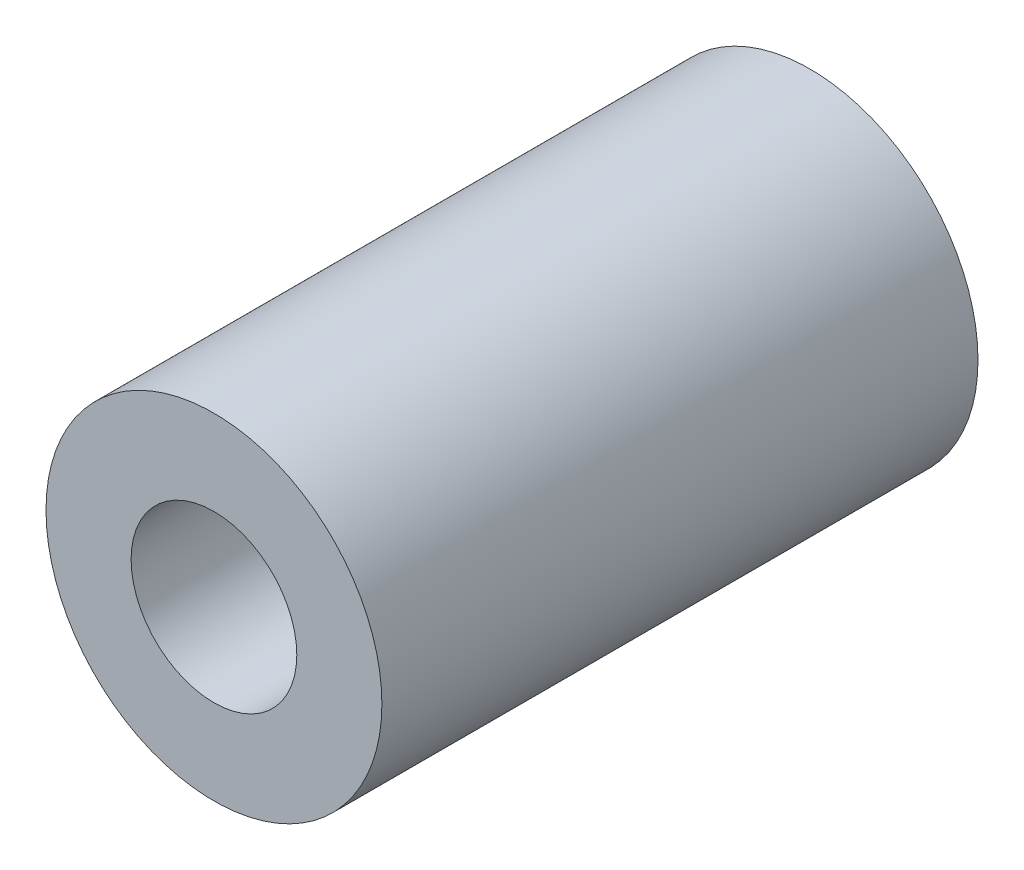
ISO-10303-21;
HEADER;
FILE_DESCRIPTION(('STEP AP214'),'2;1');
FILE_NAME('part.step','',(''),(''),'','','');
FILE_SCHEMA(('AUTOMOTIVE_DESIGN { 1 0 10303 214 1 1 1 1 }'));
ENDSEC;
DATA;
#1=APPLICATION_CONTEXT('core data for automotive mechanical design processes');
#2=APPLICATION_PROTOCOL_DEFINITION('international standard','automotive_design',2000,#1);
#3=PRODUCT_CONTEXT('',#1,'mechanical');
#4=PRODUCT('Part','Part','',(#3));
#5=PRODUCT_RELATED_PRODUCT_CATEGORY('part','',(#4));
#6=PRODUCT_DEFINITION_FORMATION('','',#4);
#7=PRODUCT_DEFINITION_CONTEXT('part definition',#1,'design');
#8=PRODUCT_DEFINITION('design','',#6,#7);
#9=PRODUCT_DEFINITION_SHAPE('','',#8);
#10=(LENGTH_UNIT() NAMED_UNIT(*) SI_UNIT(.MILLI.,.METRE.));
#11=(NAMED_UNIT(*) PLANE_ANGLE_UNIT() SI_UNIT($,.RADIAN.));
#12=(NAMED_UNIT(*) SI_UNIT($,.STERADIAN.) SOLID_ANGLE_UNIT());
#13=UNCERTAINTY_MEASURE_WITH_UNIT(LENGTH_MEASURE(1.E-05),#10,'distance_accuracy_value','');
#14=(GEOMETRIC_REPRESENTATION_CONTEXT(3) GLOBAL_UNCERTAINTY_ASSIGNED_CONTEXT((#13)) GLOBAL_UNIT_ASSIGNED_CONTEXT((#10,
#11,#12)) REPRESENTATION_CONTEXT('',''));
#15=CARTESIAN_POINT('',(0.,0.,0.));
#16=DIRECTION('',(0.,0.,1.));
#17=DIRECTION('',(1.,0.,0.));
#18=AXIS2_PLACEMENT_3D('',#15,#16,#17);
#19=CARTESIAN_POINT('',(0.,0.,26.62));
#20=DIRECTION('',(0.,0.,-1.));
#21=DIRECTION('',(-1.,0.,0.));
#22=AXIS2_PLACEMENT_3D('',#19,#20,#21);
#23=CYLINDRICAL_SURFACE('',#22,7.5);
#24=CARTESIAN_POINT('',(0.,0.,26.62));
#25=DIRECTION('',(0.,0.,1.));
#26=DIRECTION('',(1.,0.,0.));
#27=AXIS2_PLACEMENT_3D('',#24,#25,#26);
#28=CIRCLE('',#27,7.5);
#29=CARTESIAN_POINT('',(-7.5,0.,26.62));
#30=VERTEX_POINT('',#29);
#31=EDGE_CURVE('E10',#30,#30,#28,.T.);
#32=CARTESIAN_POINT('',(0.,0.,0.));
#33=DIRECTION('',(0.,0.,1.));
#34=DIRECTION('',(1.,0.,0.));
#35=AXIS2_PLACEMENT_3D('',#32,#33,#34);
#36=CIRCLE('',#35,7.5);
#37=CARTESIAN_POINT('',(-7.5,0.,0.));
#38=VERTEX_POINT('',#37);
#39=EDGE_CURVE('E35',#38,#38,#36,.T.);
#40=CARTESIAN_POINT('',(-7.5,0.,26.62));
#41=CARTESIAN_POINT('',(-7.5,0.,26.3427083333333));
#42=CARTESIAN_POINT('',(-7.5,0.,26.0654166666667));
#43=CARTESIAN_POINT('',(-7.5,0.,25.5108333333333));
#44=CARTESIAN_POINT('',(-7.5,0.,25.2335416666667));
#45=CARTESIAN_POINT('',(-7.5,0.,24.6789583333333));
#46=CARTESIAN_POINT('',(-7.5,0.,24.4016666666667));
#47=CARTESIAN_POINT('',(-7.5,0.,23.8470833333333));
#48=CARTESIAN_POINT('',(-7.5,0.,23.5697916666667));
#49=CARTESIAN_POINT('',(-7.5,0.,23.0152083333333));
#50=CARTESIAN_POINT('',(-7.5,0.,22.7379166666667));
#51=CARTESIAN_POINT('',(-7.5,0.,22.1833333333333));
#52=CARTESIAN_POINT('',(-7.5,0.,21.9060416666667));
#53=CARTESIAN_POINT('',(-7.5,0.,21.3514583333333));
#54=CARTESIAN_POINT('',(-7.5,0.,21.0741666666667));
#55=CARTESIAN_POINT('',(-7.5,0.,20.5195833333333));
#56=CARTESIAN_POINT('',(-7.5,0.,20.2422916666667));
#57=CARTESIAN_POINT('',(-7.5,0.,19.6877083333333));
#58=CARTESIAN_POINT('',(-7.5,0.,19.4104166666667));
#59=CARTESIAN_POINT('',(-7.5,0.,18.8558333333333));
#60=CARTESIAN_POINT('',(-7.5,0.,18.5785416666667));
#61=CARTESIAN_POINT('',(-7.5,0.,18.0239583333333));
#62=CARTESIAN_POINT('',(-7.5,0.,17.7466666666667));
#63=CARTESIAN_POINT('',(-7.5,0.,17.1920833333333));
#64=CARTESIAN_POINT('',(-7.5,0.,16.9147916666667));
#65=CARTESIAN_POINT('',(-7.5,0.,16.3602083333333));
#66=CARTESIAN_POINT('',(-7.5,0.,16.0829166666667));
#67=CARTESIAN_POINT('',(-7.5,0.,15.5283333333333));
#68=CARTESIAN_POINT('',(-7.5,0.,15.2510416666667));
#69=CARTESIAN_POINT('',(-7.5,0.,14.6964583333333));
#70=CARTESIAN_POINT('',(-7.5,0.,14.4191666666667));
#71=CARTESIAN_POINT('',(-7.5,0.,13.8645833333333));
#72=CARTESIAN_POINT('',(-7.5,0.,13.5872916666667));
#73=CARTESIAN_POINT('',(-7.5,0.,13.0327083333333));
#74=CARTESIAN_POINT('',(-7.5,0.,12.7554166666667));
#75=CARTESIAN_POINT('',(-7.5,0.,12.2008333333333));
#76=CARTESIAN_POINT('',(-7.5,0.,11.9235416666667));
#77=CARTESIAN_POINT('',(-7.5,0.,11.3689583333333));
#78=CARTESIAN_POINT('',(-7.5,0.,11.0916666666667));
#79=CARTESIAN_POINT('',(-7.5,0.,10.5370833333333));
#80=CARTESIAN_POINT('',(-7.5,0.,10.2597916666667));
#81=CARTESIAN_POINT('',(-7.5,0.,9.70520833333333));
#82=CARTESIAN_POINT('',(-7.5,0.,9.42791666666667));
#83=CARTESIAN_POINT('',(-7.5,0.,8.87333333333333));
#84=CARTESIAN_POINT('',(-7.5,0.,8.59604166666667));
#85=CARTESIAN_POINT('',(-7.5,0.,8.04145833333333));
#86=CARTESIAN_POINT('',(-7.5,0.,7.76416666666667));
#87=CARTESIAN_POINT('',(-7.5,0.,7.20958333333333));
#88=CARTESIAN_POINT('',(-7.5,0.,6.93229166666667));
#89=CARTESIAN_POINT('',(-7.5,0.,6.37770833333334));
#90=CARTESIAN_POINT('',(-7.5,0.,6.10041666666667));
#91=CARTESIAN_POINT('',(-7.5,0.,5.54583333333333));
#92=CARTESIAN_POINT('',(-7.5,0.,5.26854166666667));
#93=CARTESIAN_POINT('',(-7.5,0.,4.71395833333333));
#94=CARTESIAN_POINT('',(-7.5,0.,4.43666666666667));
#95=CARTESIAN_POINT('',(-7.5,0.,3.88208333333333));
#96=CARTESIAN_POINT('',(-7.5,0.,3.60479166666667));
#97=CARTESIAN_POINT('',(-7.5,0.,3.05020833333333));
#98=CARTESIAN_POINT('',(-7.5,0.,2.77291666666667));
#99=CARTESIAN_POINT('',(-7.5,0.,2.21833333333333));
#100=CARTESIAN_POINT('',(-7.5,0.,1.94104166666667));
#101=CARTESIAN_POINT('',(-7.5,0.,1.38645833333333));
#102=CARTESIAN_POINT('',(-7.5,0.,1.10916666666667));
#103=CARTESIAN_POINT('',(-7.5,0.,0.554583333333333));
#104=CARTESIAN_POINT('',(-7.5,0.,0.277291666666667));
#105=CARTESIAN_POINT('',(-7.5,0.,0.));
#106=B_SPLINE_CURVE_WITH_KNOTS('',3,(#40,#41,#42,#43,#44,#45,#46,#47,#48,#49,#50,#51,#52,#53,
#54,#55,#56,#57,#58,#59,#60,#61,#62,#63,#64,#65,#66,#67,#68,#69,#70,#71,#72,#73,#74,#75,#76,#77,
#78,#79,#80,#81,#82,#83,#84,#85,#86,#87,#88,#89,#90,#91,#92,#93,#94,#95,#96,#97,#98,#99,#100,
#101,#102,#103,#104,#105),.UNSPECIFIED.,.F.,.F.,(4,2,2,2,2,2,2,2,2,2,2,2,2,2,2,2,2,2,2,2,2,2,2,
2,2,2,2,2,2,2,2,2,4),(0.,0.831874999999999,1.66375,2.495625,3.3275,4.159375,4.99125,5.823125,
6.655,7.486875,8.31875,9.150625,9.9825,10.814375,11.64625,12.478125,13.31,14.141875,14.97375,
15.805625,16.6375,17.469375,18.30125,19.133125,19.965,20.796875,21.62875,22.460625,23.2925,
24.124375,24.95625,25.788125,26.62),.UNSPECIFIED.);
#107=EDGE_CURVE('BSEAM32',#30,#38,#106,.T.);
#108=ORIENTED_EDGE('',*,*,#31,.F.);
#109=ORIENTED_EDGE('',*,*,#39,.T.);
#110=ORIENTED_EDGE('',*,*,#107,.T.);
#111=ORIENTED_EDGE('',*,*,#107,.F.);
#112=EDGE_LOOP('',(#108,#110,#109,#111));
#113=FACE_BOUND('',#112,.T.);
#114=ADVANCED_FACE('F32',(#113),#23,.T.);
#115=CARTESIAN_POINT('',(0.,0.,26.62));
#116=DIRECTION('',(0.,0.,1.));
#117=DIRECTION('',(1.,0.,0.));
#118=AXIS2_PLACEMENT_3D('',#115,#116,#117);
#119=PLANE('',#118);
#120=CARTESIAN_POINT('',(0.,0.,26.62));
#121=DIRECTION('',(0.,0.,-1.));
#122=DIRECTION('',(-1.,0.,0.));
#123=AXIS2_PLACEMENT_3D('',#120,#121,#122);
#124=CIRCLE('',#123,3.7);
#125=CARTESIAN_POINT('',(-3.7,0.,26.62));
#126=VERTEX_POINT('',#125);
#127=EDGE_CURVE('E42',#126,#126,#124,.T.);
#128=ORIENTED_EDGE('',*,*,#127,.T.);
#129=EDGE_LOOP('',(#128));
#130=FACE_BOUND('',#129,.T.);
#131=ORIENTED_EDGE('',*,*,#31,.T.);
#132=EDGE_LOOP('',(#131));
#133=FACE_BOUND('',#132,.T.);
#134=ADVANCED_FACE('F50',(#130,#133),#119,.T.);
#135=CARTESIAN_POINT('',(0.,0.,0.));
#136=DIRECTION('',(0.,0.,1.));
#137=DIRECTION('',(1.,0.,0.));
#138=AXIS2_PLACEMENT_3D('',#135,#136,#137);
#139=PLANE('',#138);
#140=CARTESIAN_POINT('',(0.,0.,0.));
#141=DIRECTION('',(0.,0.,-1.));
#142=DIRECTION('',(-1.,0.,0.));
#143=AXIS2_PLACEMENT_3D('',#140,#141,#142);
#144=CIRCLE('',#143,3.7);
#145=CARTESIAN_POINT('',(-3.7,0.,0.));
#146=VERTEX_POINT('',#145);
#147=EDGE_CURVE('E44',#146,#146,#144,.T.);
#148=ORIENTED_EDGE('',*,*,#147,.F.);
#149=EDGE_LOOP('',(#148));
#150=FACE_BOUND('',#149,.T.);
#151=ORIENTED_EDGE('',*,*,#39,.F.);
#152=EDGE_LOOP('',(#151));
#153=FACE_BOUND('',#152,.T.);
#154=ADVANCED_FACE('F55',(#150,#153),#139,.F.);
#155=CARTESIAN_POINT('',(0.,0.,26.62));
#156=DIRECTION('',(0.,0.,-1.));
#157=DIRECTION('',(-1.,0.,0.));
#158=AXIS2_PLACEMENT_3D('',#155,#156,#157);
#159=CYLINDRICAL_SURFACE('',#158,3.7);
#160=CARTESIAN_POINT('',(-3.7,0.,26.62));
#161=CARTESIAN_POINT('',(-3.7,0.,26.3427083333333));
#162=CARTESIAN_POINT('',(-3.7,0.,26.0654166666667));
#163=CARTESIAN_POINT('',(-3.7,0.,25.5108333333333));
#164=CARTESIAN_POINT('',(-3.7,0.,25.2335416666667));
#165=CARTESIAN_POINT('',(-3.7,0.,24.6789583333333));
#166=CARTESIAN_POINT('',(-3.7,0.,24.4016666666667));
#167=CARTESIAN_POINT('',(-3.7,0.,23.8470833333333));
#168=CARTESIAN_POINT('',(-3.7,0.,23.5697916666667));
#169=CARTESIAN_POINT('',(-3.7,0.,23.0152083333333));
#170=CARTESIAN_POINT('',(-3.7,0.,22.7379166666667));
#171=CARTESIAN_POINT('',(-3.7,0.,22.1833333333333));
#172=CARTESIAN_POINT('',(-3.7,0.,21.9060416666667));
#173=CARTESIAN_POINT('',(-3.7,0.,21.3514583333333));
#174=CARTESIAN_POINT('',(-3.7,0.,21.0741666666667));
#175=CARTESIAN_POINT('',(-3.7,0.,20.5195833333333));
#176=CARTESIAN_POINT('',(-3.7,0.,20.2422916666667));
#177=CARTESIAN_POINT('',(-3.7,0.,19.6877083333333));
#178=CARTESIAN_POINT('',(-3.7,0.,19.4104166666667));
#179=CARTESIAN_POINT('',(-3.7,0.,18.8558333333333));
#180=CARTESIAN_POINT('',(-3.7,0.,18.5785416666667));
#181=CARTESIAN_POINT('',(-3.7,0.,18.0239583333333));
#182=CARTESIAN_POINT('',(-3.7,0.,17.7466666666667));
#183=CARTESIAN_POINT('',(-3.7,0.,17.1920833333333));
#184=CARTESIAN_POINT('',(-3.7,0.,16.9147916666667));
#185=CARTESIAN_POINT('',(-3.7,0.,16.3602083333333));
#186=CARTESIAN_POINT('',(-3.7,0.,16.0829166666667));
#187=CARTESIAN_POINT('',(-3.7,0.,15.5283333333333));
#188=CARTESIAN_POINT('',(-3.7,0.,15.2510416666667));
#189=CARTESIAN_POINT('',(-3.7,0.,14.6964583333333));
#190=CARTESIAN_POINT('',(-3.7,0.,14.4191666666667));
#191=CARTESIAN_POINT('',(-3.7,0.,13.8645833333333));
#192=CARTESIAN_POINT('',(-3.7,0.,13.5872916666667));
#193=CARTESIAN_POINT('',(-3.7,0.,13.0327083333333));
#194=CARTESIAN_POINT('',(-3.7,0.,12.7554166666667));
#195=CARTESIAN_POINT('',(-3.7,0.,12.2008333333333));
#196=CARTESIAN_POINT('',(-3.7,0.,11.9235416666667));
#197=CARTESIAN_POINT('',(-3.7,0.,11.3689583333333));
#198=CARTESIAN_POINT('',(-3.7,0.,11.0916666666667));
#199=CARTESIAN_POINT('',(-3.7,0.,10.5370833333333));
#200=CARTESIAN_POINT('',(-3.7,0.,10.2597916666667));
#201=CARTESIAN_POINT('',(-3.7,0.,9.70520833333333));
#202=CARTESIAN_POINT('',(-3.7,0.,9.42791666666667));
#203=CARTESIAN_POINT('',(-3.7,0.,8.87333333333333));
#204=CARTESIAN_POINT('',(-3.7,0.,8.59604166666667));
#205=CARTESIAN_POINT('',(-3.7,0.,8.04145833333334));
#206=CARTESIAN_POINT('',(-3.7,0.,7.76416666666667));
#207=CARTESIAN_POINT('',(-3.7,0.,7.20958333333334));
#208=CARTESIAN_POINT('',(-3.7,0.,6.93229166666667));
#209=CARTESIAN_POINT('',(-3.7,0.,6.37770833333334));
#210=CARTESIAN_POINT('',(-3.7,0.,6.10041666666667));
#211=CARTESIAN_POINT('',(-3.7,0.,5.54583333333334));
#212=CARTESIAN_POINT('',(-3.7,0.,5.26854166666667));
#213=CARTESIAN_POINT('',(-3.7,0.,4.71395833333334));
#214=CARTESIAN_POINT('',(-3.7,0.,4.43666666666667));
#215=CARTESIAN_POINT('',(-3.7,0.,3.88208333333333));
#216=CARTESIAN_POINT('',(-3.7,0.,3.60479166666667));
#217=CARTESIAN_POINT('',(-3.7,0.,3.05020833333333));
#218=CARTESIAN_POINT('',(-3.7,0.,2.77291666666667));
#219=CARTESIAN_POINT('',(-3.7,0.,2.21833333333334));
#220=CARTESIAN_POINT('',(-3.7,0.,1.94104166666667));
#221=CARTESIAN_POINT('',(-3.7,0.,1.38645833333333));
#222=CARTESIAN_POINT('',(-3.7,0.,1.10916666666667));
#223=CARTESIAN_POINT('',(-3.7,0.,0.554583333333333));
#224=CARTESIAN_POINT('',(-3.7,0.,0.277291666666666));
#225=CARTESIAN_POINT('',(-3.7,0.,0.));
#226=B_SPLINE_CURVE_WITH_KNOTS('',3,(#160,#161,#162,#163,#164,#165,#166,#167,#168,#169,#170,
#171,#172,#173,#174,#175,#176,#177,#178,#179,#180,#181,#182,#183,#184,#185,#186,#187,#188,#189,
#190,#191,#192,#193,#194,#195,#196,#197,#198,#199,#200,#201,#202,#203,#204,#205,#206,#207,#208,
#209,#210,#211,#212,#213,#214,#215,#216,#217,#218,#219,#220,#221,#222,#223,#224,#225),
.UNSPECIFIED.,.F.,.F.,(4,2,2,2,2,2,2,2,2,2,2,2,2,2,2,2,2,2,2,2,2,2,2,2,2,2,2,2,2,2,2,2,4),(0.,
0.831875000000003,1.66375,2.495625,3.3275,4.159375,4.99125,5.823125,6.655,7.486875,8.31875,
9.150625,9.98250000000001,10.814375,11.64625,12.478125,13.31,14.141875,14.97375,15.805625,
16.6375,17.469375,18.30125,19.133125,19.965,20.796875,21.62875,22.460625,23.2925,24.124375,
24.95625,25.788125,26.62),.UNSPECIFIED.);
#227=EDGE_CURVE('BSEAM52',#126,#146,#226,.T.);
#228=ORIENTED_EDGE('',*,*,#127,.F.);
#229=ORIENTED_EDGE('',*,*,#147,.T.);
#230=ORIENTED_EDGE('',*,*,#227,.T.);
#231=ORIENTED_EDGE('',*,*,#227,.F.);
#232=EDGE_LOOP('',(#228,#230,#229,#231));
#233=FACE_BOUND('',#232,.T.);
#234=ADVANCED_FACE('F52',(#233),#159,.F.);
#235=CLOSED_SHELL('',(#114,#134,#154,#234));
#236=MANIFOLD_SOLID_BREP('B2',#235);
#237=ADVANCED_BREP_SHAPE_REPRESENTATION('',(#18,#236),#14);
#238=SHAPE_DEFINITION_REPRESENTATION(#9,#237);
ENDSEC;
END-ISO-10303-21;
